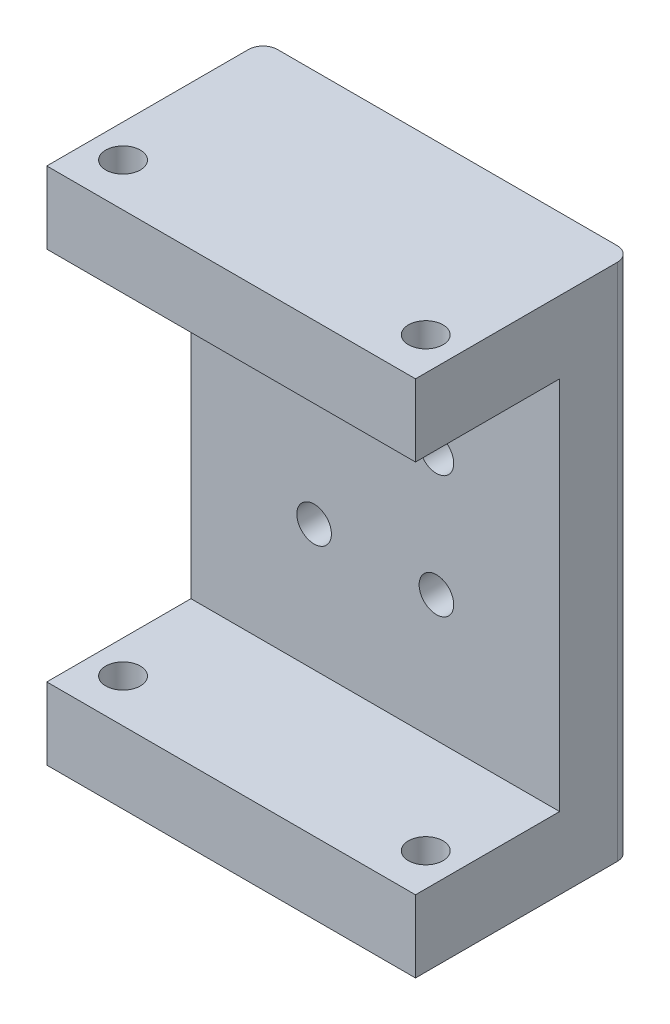
ISO-10303-21;
HEADER;
FILE_DESCRIPTION(('STEP AP214'),'2;1');
FILE_NAME('part.step','',(''),(''),'','','');
FILE_SCHEMA(('AUTOMOTIVE_DESIGN { 1 0 10303 214 1 1 1 1 }'));
ENDSEC;
DATA;
#1=APPLICATION_CONTEXT('core data for automotive mechanical design processes');
#2=APPLICATION_PROTOCOL_DEFINITION('international standard','automotive_design',2000,#1);
#3=PRODUCT_CONTEXT('',#1,'mechanical');
#4=PRODUCT('Part','Part','',(#3));
#5=PRODUCT_RELATED_PRODUCT_CATEGORY('part','',(#4));
#6=PRODUCT_DEFINITION_FORMATION('','',#4);
#7=PRODUCT_DEFINITION_CONTEXT('part definition',#1,'design');
#8=PRODUCT_DEFINITION('design','',#6,#7);
#9=PRODUCT_DEFINITION_SHAPE('','',#8);
#10=(LENGTH_UNIT() NAMED_UNIT(*) SI_UNIT(.MILLI.,.METRE.));
#11=(NAMED_UNIT(*) PLANE_ANGLE_UNIT() SI_UNIT($,.RADIAN.));
#12=(NAMED_UNIT(*) SI_UNIT($,.STERADIAN.) SOLID_ANGLE_UNIT());
#13=UNCERTAINTY_MEASURE_WITH_UNIT(LENGTH_MEASURE(1.E-05),#10,'distance_accuracy_value','');
#14=(GEOMETRIC_REPRESENTATION_CONTEXT(3) GLOBAL_UNCERTAINTY_ASSIGNED_CONTEXT((#13)) GLOBAL_UNIT_ASSIGNED_CONTEXT((#10,
#11,#12)) REPRESENTATION_CONTEXT('',''));
#15=CARTESIAN_POINT('',(0.,0.,0.));
#16=DIRECTION('',(0.,0.,1.));
#17=DIRECTION('',(1.,0.,0.));
#18=AXIS2_PLACEMENT_3D('',#15,#16,#17);
#19=CARTESIAN_POINT('',(-12.79,18.,15.));
#20=DIRECTION('',(0.,-1.,0.));
#21=DIRECTION('',(0.,0.,-1.));
#22=AXIS2_PLACEMENT_3D('',#19,#20,#21);
#23=PLANE('',#22);
#24=CARTESIAN_POINT('',(10.5,18.,12.));
#25=DIRECTION('',(0.,1.,0.));
#26=DIRECTION('',(0.,0.,1.));
#27=AXIS2_PLACEMENT_3D('',#24,#25,#26);
#28=CIRCLE('',#27,1.19999999999999);
#29=CARTESIAN_POINT('',(10.5,18.,13.2));
#30=VERTEX_POINT('',#29);
#31=EDGE_CURVE('E293',#30,#30,#28,.T.);
#32=ORIENTED_EDGE('',*,*,#31,.F.);
#33=EDGE_LOOP('',(#32));
#34=FACE_BOUND('',#33,.T.);
#35=DIRECTION('',(0.,0.,-1.));
#36=VECTOR('',#35,1.);
#37=CARTESIAN_POINT('',(12.79,18.,15.));
#38=LINE('',#37,#36);
#39=CARTESIAN_POINT('',(12.79,18.,15.));
#40=VERTEX_POINT('',#39);
#41=CARTESIAN_POINT('',(12.79,18.,1.));
#42=VERTEX_POINT('',#41);
#43=EDGE_CURVE('E186',#40,#42,#38,.T.);
#44=ORIENTED_EDGE('',*,*,#43,.T.);
#45=CARTESIAN_POINT('',(11.79,18.,1.));
#46=DIRECTION('',(0.,-1.,0.));
#47=DIRECTION('',(0.,0.,-1.));
#48=AXIS2_PLACEMENT_3D('',#45,#46,#47);
#49=CIRCLE('',#48,1.);
#50=CARTESIAN_POINT('',(11.79,18.,0.));
#51=VERTEX_POINT('',#50);
#52=EDGE_CURVE('E198',#42,#51,#49,.F.);
#53=ORIENTED_EDGE('',*,*,#52,.T.);
#54=DIRECTION('',(-1.,0.,0.));
#55=VECTOR('',#54,1.);
#56=CARTESIAN_POINT('',(-12.79,18.,0.));
#57=LINE('',#56,#55);
#58=CARTESIAN_POINT('',(-11.79,18.,0.));
#59=VERTEX_POINT('',#58);
#60=EDGE_CURVE('E160',#51,#59,#57,.T.);
#61=ORIENTED_EDGE('',*,*,#60,.T.);
#62=CARTESIAN_POINT('',(-11.79,18.,1.));
#63=DIRECTION('',(0.,-1.,0.));
#64=DIRECTION('',(0.,0.,-1.));
#65=AXIS2_PLACEMENT_3D('',#62,#63,#64);
#66=CIRCLE('',#65,1.);
#67=CARTESIAN_POINT('',(-12.79,18.,1.));
#68=VERTEX_POINT('',#67);
#69=EDGE_CURVE('E196',#59,#68,#66,.F.);
#70=ORIENTED_EDGE('',*,*,#69,.T.);
#71=DIRECTION('',(0.,0.,-1.));
#72=VECTOR('',#71,1.);
#73=CARTESIAN_POINT('',(-12.79,18.,15.));
#74=LINE('',#73,#72);
#75=CARTESIAN_POINT('',(-12.79,18.,15.));
#76=VERTEX_POINT('',#75);
#77=EDGE_CURVE('E183',#76,#68,#74,.T.);
#78=ORIENTED_EDGE('',*,*,#77,.F.);
#79=DIRECTION('',(-1.,0.,0.));
#80=VECTOR('',#79,1.);
#81=CARTESIAN_POINT('',(-12.79,18.,15.));
#82=LINE('',#81,#80);
#83=EDGE_CURVE('E166',#40,#76,#82,.T.);
#84=ORIENTED_EDGE('',*,*,#83,.F.);
#85=EDGE_LOOP('',(#44,#53,#61,#70,#78,#84));
#86=FACE_BOUND('',#85,.T.);
#87=CARTESIAN_POINT('',(-10.5,18.,12.));
#88=DIRECTION('',(0.,1.,0.));
#89=DIRECTION('',(0.,0.,1.));
#90=AXIS2_PLACEMENT_3D('',#87,#88,#89);
#91=CIRCLE('',#90,1.19999999999999);
#92=CARTESIAN_POINT('',(-10.5,18.,13.2));
#93=VERTEX_POINT('',#92);
#94=EDGE_CURVE('E296',#93,#93,#91,.T.);
#95=ORIENTED_EDGE('',*,*,#94,.F.);
#96=EDGE_LOOP('',(#95));
#97=FACE_BOUND('',#96,.T.);
#98=ADVANCED_FACE('F41',(#34,#86,#97),#23,.F.);
#99=CARTESIAN_POINT('',(0.,0.,15.));
#100=DIRECTION('',(0.,0.,1.));
#101=DIRECTION('',(1.,0.,0.));
#102=AXIS2_PLACEMENT_3D('',#99,#100,#101);
#103=PLANE('',#102);
#104=DIRECTION('',(-1.,0.,0.));
#105=VECTOR('',#104,1.);
#106=CARTESIAN_POINT('',(12.79,-13.,15.));
#107=LINE('',#106,#105);
#108=CARTESIAN_POINT('',(12.79,-13.,15.));
#109=VERTEX_POINT('',#108);
#110=CARTESIAN_POINT('',(-12.79,-13.,15.));
#111=VERTEX_POINT('',#110);
#112=EDGE_CURVE('E157',#109,#111,#107,.T.);
#113=ORIENTED_EDGE('',*,*,#112,.T.);
#114=DIRECTION('',(0.,-1.,0.));
#115=VECTOR('',#114,1.);
#116=CARTESIAN_POINT('',(-12.79,18.,15.));
#117=LINE('',#116,#115);
#118=CARTESIAN_POINT('',(-12.79,-18.,15.));
#119=VERTEX_POINT('',#118);
#120=EDGE_CURVE('E168',#111,#119,#117,.T.);
#121=ORIENTED_EDGE('',*,*,#120,.T.);
#122=DIRECTION('',(1.,0.,0.));
#123=VECTOR('',#122,1.);
#124=CARTESIAN_POINT('',(-12.79,-18.,15.));
#125=LINE('',#124,#123);
#126=CARTESIAN_POINT('',(12.79,-18.,15.));
#127=VERTEX_POINT('',#126);
#128=EDGE_CURVE('E172',#119,#127,#125,.T.);
#129=ORIENTED_EDGE('',*,*,#128,.T.);
#130=DIRECTION('',(0.,1.,0.));
#131=VECTOR('',#130,1.);
#132=CARTESIAN_POINT('',(12.79,18.,15.));
#133=LINE('',#132,#131);
#134=EDGE_CURVE('E163',#127,#109,#133,.T.);
#135=ORIENTED_EDGE('',*,*,#134,.T.);
#136=EDGE_LOOP('',(#113,#121,#129,#135));
#137=FACE_BOUND('',#136,.T.);
#138=ADVANCED_FACE('F226',(#137),#103,.T.);
#139=CARTESIAN_POINT('',(12.79,18.,15.));
#140=DIRECTION('',(-1.,0.,0.));
#141=DIRECTION('',(0.,-1.,0.));
#142=AXIS2_PLACEMENT_3D('',#139,#140,#141);
#143=PLANE('',#142);
#144=DIRECTION('',(0.,0.,-1.));
#145=VECTOR('',#144,1.);
#146=CARTESIAN_POINT('',(12.79,-18.,15.));
#147=LINE('',#146,#145);
#148=CARTESIAN_POINT('',(12.79,-18.,1.));
#149=VERTEX_POINT('',#148);
#150=EDGE_CURVE('E174',#127,#149,#147,.T.);
#151=ORIENTED_EDGE('',*,*,#150,.T.);
#152=DIRECTION('',(0.,1.,0.));
#153=VECTOR('',#152,1.);
#154=CARTESIAN_POINT('',(12.79,18.,1.));
#155=LINE('',#154,#153);
#156=EDGE_CURVE('E189',#149,#42,#155,.T.);
#157=ORIENTED_EDGE('',*,*,#156,.T.);
#158=ORIENTED_EDGE('',*,*,#43,.F.);
#159=CARTESIAN_POINT('',(12.79,13.,15.));
#160=VERTEX_POINT('',#159);
#161=EDGE_CURVE('E145',#160,#40,#133,.T.);
#162=ORIENTED_EDGE('',*,*,#161,.F.);
#163=DIRECTION('',(0.,0.,-1.));
#164=VECTOR('',#163,1.);
#165=CARTESIAN_POINT('',(12.79,13.,15.));
#166=LINE('',#165,#164);
#167=CARTESIAN_POINT('',(12.79,13.,5.));
#168=VERTEX_POINT('',#167);
#169=EDGE_CURVE('E123',#160,#168,#166,.T.);
#170=ORIENTED_EDGE('',*,*,#169,.T.);
#171=DIRECTION('',(0.,-1.,0.));
#172=VECTOR('',#171,1.);
#173=CARTESIAN_POINT('',(12.79,13.,5.));
#174=LINE('',#173,#172);
#175=CARTESIAN_POINT('',(12.79,-13.,5.));
#176=VERTEX_POINT('',#175);
#177=EDGE_CURVE('E134',#168,#176,#174,.T.);
#178=ORIENTED_EDGE('',*,*,#177,.T.);
#179=DIRECTION('',(0.,0.,1.));
#180=VECTOR('',#179,1.);
#181=CARTESIAN_POINT('',(12.79,-13.,15.));
#182=LINE('',#181,#180);
#183=EDGE_CURVE('E139',#176,#109,#182,.T.);
#184=ORIENTED_EDGE('',*,*,#183,.T.);
#185=ORIENTED_EDGE('',*,*,#134,.F.);
#186=EDGE_LOOP('',(#151,#157,#158,#162,#170,#178,#184,#185));
#187=FACE_BOUND('',#186,.T.);
#188=ADVANCED_FACE('F143',(#187),#143,.F.);
#189=CARTESIAN_POINT('',(-12.79,18.,15.));
#190=DIRECTION('',(1.,0.,0.));
#191=DIRECTION('',(0.,1.,0.));
#192=AXIS2_PLACEMENT_3D('',#189,#190,#191);
#193=PLANE('',#192);
#194=ORIENTED_EDGE('',*,*,#77,.T.);
#195=DIRECTION('',(0.,-1.,0.));
#196=VECTOR('',#195,1.);
#197=CARTESIAN_POINT('',(-12.79,18.,1.));
#198=LINE('',#197,#196);
#199=CARTESIAN_POINT('',(-12.79,-18.,1.));
#200=VERTEX_POINT('',#199);
#201=EDGE_CURVE('E11',#68,#200,#198,.T.);
#202=ORIENTED_EDGE('',*,*,#201,.T.);
#203=DIRECTION('',(0.,0.,-1.));
#204=VECTOR('',#203,1.);
#205=CARTESIAN_POINT('',(-12.79,-18.,15.));
#206=LINE('',#205,#204);
#207=EDGE_CURVE('E180',#119,#200,#206,.T.);
#208=ORIENTED_EDGE('',*,*,#207,.F.);
#209=ORIENTED_EDGE('',*,*,#120,.F.);
#210=DIRECTION('',(0.,0.,1.));
#211=VECTOR('',#210,1.);
#212=CARTESIAN_POINT('',(-12.79,-13.,15.));
#213=LINE('',#212,#211);
#214=CARTESIAN_POINT('',(-12.79,-13.,5.));
#215=VERTEX_POINT('',#214);
#216=EDGE_CURVE('E146',#215,#111,#213,.T.);
#217=ORIENTED_EDGE('',*,*,#216,.F.);
#218=DIRECTION('',(0.,-1.,0.));
#219=VECTOR('',#218,1.);
#220=CARTESIAN_POINT('',(-12.79,13.,5.));
#221=LINE('',#220,#219);
#222=CARTESIAN_POINT('',(-12.79,13.,5.));
#223=VERTEX_POINT('',#222);
#224=EDGE_CURVE('E148',#223,#215,#221,.T.);
#225=ORIENTED_EDGE('',*,*,#224,.F.);
#226=DIRECTION('',(0.,0.,-1.));
#227=VECTOR('',#226,1.);
#228=CARTESIAN_POINT('',(-12.79,13.,15.));
#229=LINE('',#228,#227);
#230=CARTESIAN_POINT('',(-12.79,13.,15.));
#231=VERTEX_POINT('',#230);
#232=EDGE_CURVE('E126',#231,#223,#229,.T.);
#233=ORIENTED_EDGE('',*,*,#232,.F.);
#234=EDGE_CURVE('E169',#76,#231,#117,.T.);
#235=ORIENTED_EDGE('',*,*,#234,.F.);
#236=EDGE_LOOP('',(#194,#202,#208,#209,#217,#225,#233,#235));
#237=FACE_BOUND('',#236,.T.);
#238=ADVANCED_FACE('F220',(#237),#193,.F.);
#239=CARTESIAN_POINT('',(-12.79,-18.,15.));
#240=DIRECTION('',(0.,1.,0.));
#241=DIRECTION('',(0.,0.,1.));
#242=AXIS2_PLACEMENT_3D('',#239,#240,#241);
#243=PLANE('',#242);
#244=CARTESIAN_POINT('',(-10.5,-18.,12.));
#245=DIRECTION('',(0.,1.,0.));
#246=DIRECTION('',(0.,0.,1.));
#247=AXIS2_PLACEMENT_3D('',#244,#245,#246);
#248=CIRCLE('',#247,1.19999999999998);
#249=CARTESIAN_POINT('',(-10.5,-18.,13.2));
#250=VERTEX_POINT('',#249);
#251=EDGE_CURVE('E290',#250,#250,#248,.T.);
#252=ORIENTED_EDGE('',*,*,#251,.T.);
#253=EDGE_LOOP('',(#252));
#254=FACE_BOUND('',#253,.T.);
#255=CARTESIAN_POINT('',(10.5,-18.,12.));
#256=DIRECTION('',(0.,1.,0.));
#257=DIRECTION('',(0.,0.,1.));
#258=AXIS2_PLACEMENT_3D('',#255,#256,#257);
#259=CIRCLE('',#258,1.19999999999998);
#260=CARTESIAN_POINT('',(10.5,-18.,13.2));
#261=VERTEX_POINT('',#260);
#262=EDGE_CURVE('E193',#261,#261,#259,.T.);
#263=ORIENTED_EDGE('',*,*,#262,.T.);
#264=EDGE_LOOP('',(#263));
#265=FACE_BOUND('',#264,.T.);
#266=DIRECTION('',(1.,0.,0.));
#267=VECTOR('',#266,1.);
#268=CARTESIAN_POINT('',(-12.79,-18.,0.));
#269=LINE('',#268,#267);
#270=CARTESIAN_POINT('',(-11.79,-18.,0.));
#271=VERTEX_POINT('',#270);
#272=CARTESIAN_POINT('',(11.79,-18.,0.));
#273=VERTEX_POINT('',#272);
#274=EDGE_CURVE('E177',#271,#273,#269,.T.);
#275=ORIENTED_EDGE('',*,*,#274,.T.);
#276=CARTESIAN_POINT('',(11.79,-18.,1.));
#277=DIRECTION('',(0.,1.,0.));
#278=DIRECTION('',(0.,0.,1.));
#279=AXIS2_PLACEMENT_3D('',#276,#277,#278);
#280=CIRCLE('',#279,1.);
#281=EDGE_CURVE('E49',#273,#149,#280,.F.);
#282=ORIENTED_EDGE('',*,*,#281,.T.);
#283=ORIENTED_EDGE('',*,*,#150,.F.);
#284=ORIENTED_EDGE('',*,*,#128,.F.);
#285=ORIENTED_EDGE('',*,*,#207,.T.);
#286=CARTESIAN_POINT('',(-11.79,-18.,1.));
#287=DIRECTION('',(0.,1.,0.));
#288=DIRECTION('',(0.,0.,1.));
#289=AXIS2_PLACEMENT_3D('',#286,#287,#288);
#290=CIRCLE('',#289,1.);
#291=EDGE_CURVE('E56',#200,#271,#290,.F.);
#292=ORIENTED_EDGE('',*,*,#291,.T.);
#293=EDGE_LOOP('',(#275,#282,#283,#284,#285,#292));
#294=FACE_BOUND('',#293,.T.);
#295=ADVANCED_FACE('F206',(#254,#265,#294),#243,.F.);
#296=DIRECTION('',(-1.,0.,0.));
#297=VECTOR('',#296,1.);
#298=CARTESIAN_POINT('',(12.79,13.,15.));
#299=LINE('',#298,#297);
#300=EDGE_CURVE('E131',#160,#231,#299,.T.);
#301=ORIENTED_EDGE('',*,*,#300,.F.);
#302=ORIENTED_EDGE('',*,*,#161,.T.);
#303=ORIENTED_EDGE('',*,*,#83,.T.);
#304=ORIENTED_EDGE('',*,*,#234,.T.);
#305=EDGE_LOOP('',(#301,#302,#303,#304));
#306=FACE_BOUND('',#305,.T.);
#307=ADVANCED_FACE('F223',(#306),#103,.T.);
#308=CARTESIAN_POINT('',(0.,0.,0.));
#309=DIRECTION('',(0.,0.,1.));
#310=DIRECTION('',(1.,0.,0.));
#311=AXIS2_PLACEMENT_3D('',#308,#309,#310);
#312=PLANE('',#311);
#313=CARTESIAN_POINT('',(4.24264068711928,4.24264068711928,0.));
#314=DIRECTION('',(0.,0.,1.));
#315=DIRECTION('',(1.,0.,0.));
#316=AXIS2_PLACEMENT_3D('',#313,#314,#315);
#317=CIRCLE('',#316,1.19999999999999);
#318=CARTESIAN_POINT('',(5.44264068711927,4.24264068711928,0.));
#319=VERTEX_POINT('',#318);
#320=EDGE_CURVE('E336',#319,#319,#317,.T.);
#321=ORIENTED_EDGE('',*,*,#320,.T.);
#322=EDGE_LOOP('',(#321));
#323=FACE_BOUND('',#322,.T.);
#324=CARTESIAN_POINT('',(-4.24264068711928,-4.24264068711928,0.));
#325=DIRECTION('',(0.,0.,1.));
#326=DIRECTION('',(1.,0.,0.));
#327=AXIS2_PLACEMENT_3D('',#324,#325,#326);
#328=CIRCLE('',#327,1.19999999999999);
#329=CARTESIAN_POINT('',(-3.0426406871193,-4.24264068711928,0.));
#330=VERTEX_POINT('',#329);
#331=EDGE_CURVE('E330',#330,#330,#328,.T.);
#332=ORIENTED_EDGE('',*,*,#331,.T.);
#333=EDGE_LOOP('',(#332));
#334=FACE_BOUND('',#333,.T.);
#335=CARTESIAN_POINT('',(4.24264068711928,-4.24264068711928,0.));
#336=DIRECTION('',(0.,0.,1.));
#337=DIRECTION('',(1.,0.,0.));
#338=AXIS2_PLACEMENT_3D('',#335,#336,#337);
#339=CIRCLE('',#338,1.19999999999999);
#340=CARTESIAN_POINT('',(5.44264068711927,-4.24264068711928,0.));
#341=VERTEX_POINT('',#340);
#342=EDGE_CURVE('E324',#341,#341,#339,.T.);
#343=ORIENTED_EDGE('',*,*,#342,.T.);
#344=EDGE_LOOP('',(#343));
#345=FACE_BOUND('',#344,.T.);
#346=CARTESIAN_POINT('',(-4.24264068711928,4.24264068711928,0.));
#347=DIRECTION('',(0.,0.,1.));
#348=DIRECTION('',(1.,0.,0.));
#349=AXIS2_PLACEMENT_3D('',#346,#347,#348);
#350=CIRCLE('',#349,1.19999999999999);
#351=CARTESIAN_POINT('',(-3.0426406871193,4.24264068711928,0.));
#352=VERTEX_POINT('',#351);
#353=EDGE_CURVE('E316',#352,#352,#350,.T.);
#354=ORIENTED_EDGE('',*,*,#353,.T.);
#355=EDGE_LOOP('',(#354));
#356=FACE_BOUND('',#355,.T.);
#357=CARTESIAN_POINT('',(0.,0.,0.));
#358=DIRECTION('',(0.,0.,-1.));
#359=DIRECTION('',(-1.,0.,0.));
#360=AXIS2_PLACEMENT_3D('',#357,#358,#359);
#361=CIRCLE('',#360,4.25);
#362=CARTESIAN_POINT('',(-4.25,0.,0.));
#363=VERTEX_POINT('',#362);
#364=EDGE_CURVE('E313',#363,#363,#361,.T.);
#365=ORIENTED_EDGE('',*,*,#364,.F.);
#366=EDGE_LOOP('',(#365));
#367=FACE_BOUND('',#366,.T.);
#368=ORIENTED_EDGE('',*,*,#60,.F.);
#369=DIRECTION('',(0.,1.,0.));
#370=VECTOR('',#369,1.);
#371=CARTESIAN_POINT('',(11.79,0.,0.));
#372=LINE('',#371,#370);
#373=EDGE_CURVE('E63',#51,#273,#372,.F.);
#374=ORIENTED_EDGE('',*,*,#373,.T.);
#375=ORIENTED_EDGE('',*,*,#274,.F.);
#376=DIRECTION('',(0.,-1.,0.));
#377=VECTOR('',#376,1.);
#378=CARTESIAN_POINT('',(-11.79,0.,0.));
#379=LINE('',#378,#377);
#380=EDGE_CURVE('E200',#271,#59,#379,.F.);
#381=ORIENTED_EDGE('',*,*,#380,.T.);
#382=EDGE_LOOP('',(#368,#374,#375,#381));
#383=FACE_BOUND('',#382,.T.);
#384=ADVANCED_FACE('F216',(#323,#334,#345,#356,#367,#383),#312,.F.);
#385=CARTESIAN_POINT('',(12.79,-13.,15.));
#386=DIRECTION('',(0.,-1.,0.));
#387=DIRECTION('',(0.,0.,-1.));
#388=AXIS2_PLACEMENT_3D('',#385,#386,#387);
#389=PLANE('',#388);
#390=CARTESIAN_POINT('',(-10.5,-13.,12.));
#391=DIRECTION('',(0.,-1.,0.));
#392=DIRECTION('',(0.,0.,-1.));
#393=AXIS2_PLACEMENT_3D('',#390,#391,#392);
#394=CIRCLE('',#393,1.19999999999999);
#395=CARTESIAN_POINT('',(-10.5,-13.,10.8));
#396=VERTEX_POINT('',#395);
#397=EDGE_CURVE('E289',#396,#396,#394,.T.);
#398=ORIENTED_EDGE('',*,*,#397,.T.);
#399=EDGE_LOOP('',(#398));
#400=FACE_BOUND('',#399,.T.);
#401=CARTESIAN_POINT('',(10.5,-13.,12.));
#402=DIRECTION('',(0.,-1.,0.));
#403=DIRECTION('',(0.,0.,-1.));
#404=AXIS2_PLACEMENT_3D('',#401,#402,#403);
#405=CIRCLE('',#404,1.19999999999999);
#406=CARTESIAN_POINT('',(10.5,-13.,10.8));
#407=VERTEX_POINT('',#406);
#408=EDGE_CURVE('E151',#407,#407,#405,.T.);
#409=ORIENTED_EDGE('',*,*,#408,.T.);
#410=EDGE_LOOP('',(#409));
#411=FACE_BOUND('',#410,.T.);
#412=ORIENTED_EDGE('',*,*,#216,.T.);
#413=ORIENTED_EDGE('',*,*,#112,.F.);
#414=ORIENTED_EDGE('',*,*,#183,.F.);
#415=DIRECTION('',(-1.,0.,0.));
#416=VECTOR('',#415,1.);
#417=CARTESIAN_POINT('',(12.79,-13.,5.));
#418=LINE('',#417,#416);
#419=EDGE_CURVE('E130',#176,#215,#418,.T.);
#420=ORIENTED_EDGE('',*,*,#419,.T.);
#421=EDGE_LOOP('',(#412,#413,#414,#420));
#422=FACE_BOUND('',#421,.T.);
#423=ADVANCED_FACE('F232',(#400,#411,#422),#389,.F.);
#424=CARTESIAN_POINT('',(12.79,13.,5.));
#425=DIRECTION('',(0.,0.,-1.));
#426=DIRECTION('',(-1.,0.,0.));
#427=AXIS2_PLACEMENT_3D('',#424,#425,#426);
#428=PLANE('',#427);
#429=CARTESIAN_POINT('',(4.24264068711928,4.24264068711928,5.));
#430=DIRECTION('',(0.,0.,1.));
#431=DIRECTION('',(1.,0.,0.));
#432=AXIS2_PLACEMENT_3D('',#429,#430,#431);
#433=CIRCLE('',#432,1.19999999999999);
#434=CARTESIAN_POINT('',(5.44264068711927,4.24264068711928,5.));
#435=VERTEX_POINT('',#434);
#436=EDGE_CURVE('E339',#435,#435,#433,.T.);
#437=ORIENTED_EDGE('',*,*,#436,.F.);
#438=EDGE_LOOP('',(#437));
#439=FACE_BOUND('',#438,.T.);
#440=CARTESIAN_POINT('',(-4.24264068711928,-4.24264068711928,5.));
#441=DIRECTION('',(0.,0.,1.));
#442=DIRECTION('',(1.,0.,0.));
#443=AXIS2_PLACEMENT_3D('',#440,#441,#442);
#444=CIRCLE('',#443,1.19999999999999);
#445=CARTESIAN_POINT('',(-3.0426406871193,-4.24264068711928,5.));
#446=VERTEX_POINT('',#445);
#447=EDGE_CURVE('E333',#446,#446,#444,.T.);
#448=ORIENTED_EDGE('',*,*,#447,.F.);
#449=EDGE_LOOP('',(#448));
#450=FACE_BOUND('',#449,.T.);
#451=CARTESIAN_POINT('',(4.24264068711928,-4.24264068711928,5.));
#452=DIRECTION('',(0.,0.,1.));
#453=DIRECTION('',(1.,0.,0.));
#454=AXIS2_PLACEMENT_3D('',#451,#452,#453);
#455=CIRCLE('',#454,1.19999999999999);
#456=CARTESIAN_POINT('',(5.44264068711927,-4.24264068711928,5.));
#457=VERTEX_POINT('',#456);
#458=EDGE_CURVE('E327',#457,#457,#455,.T.);
#459=ORIENTED_EDGE('',*,*,#458,.F.);
#460=EDGE_LOOP('',(#459));
#461=FACE_BOUND('',#460,.T.);
#462=CARTESIAN_POINT('',(-4.24264068711928,4.24264068711928,5.));
#463=DIRECTION('',(0.,0.,1.));
#464=DIRECTION('',(1.,0.,0.));
#465=AXIS2_PLACEMENT_3D('',#462,#463,#464);
#466=CIRCLE('',#465,1.19999999999999);
#467=CARTESIAN_POINT('',(-3.0426406871193,4.24264068711928,5.));
#468=VERTEX_POINT('',#467);
#469=EDGE_CURVE('E321',#468,#468,#466,.T.);
#470=ORIENTED_EDGE('',*,*,#469,.F.);
#471=EDGE_LOOP('',(#470));
#472=FACE_BOUND('',#471,.T.);
#473=ORIENTED_EDGE('',*,*,#224,.T.);
#474=ORIENTED_EDGE('',*,*,#419,.F.);
#475=ORIENTED_EDGE('',*,*,#177,.F.);
#476=DIRECTION('',(-1.,0.,0.));
#477=VECTOR('',#476,1.);
#478=CARTESIAN_POINT('',(12.79,13.,5.));
#479=LINE('',#478,#477);
#480=EDGE_CURVE('E119',#168,#223,#479,.T.);
#481=ORIENTED_EDGE('',*,*,#480,.T.);
#482=EDGE_LOOP('',(#473,#474,#475,#481));
#483=FACE_BOUND('',#482,.T.);
#484=ADVANCED_FACE('F135',(#439,#450,#461,#472,#483),#428,.F.);
#485=CARTESIAN_POINT('',(12.79,13.,15.));
#486=DIRECTION('',(0.,1.,0.));
#487=DIRECTION('',(0.,0.,1.));
#488=AXIS2_PLACEMENT_3D('',#485,#486,#487);
#489=PLANE('',#488);
#490=CARTESIAN_POINT('',(-10.5,13.,12.));
#491=DIRECTION('',(0.,1.,0.));
#492=DIRECTION('',(0.,0.,1.));
#493=AXIS2_PLACEMENT_3D('',#490,#491,#492);
#494=CIRCLE('',#493,1.19999999999999);
#495=CARTESIAN_POINT('',(-10.5,13.,13.2));
#496=VERTEX_POINT('',#495);
#497=EDGE_CURVE('E286',#496,#496,#494,.T.);
#498=ORIENTED_EDGE('',*,*,#497,.T.);
#499=EDGE_LOOP('',(#498));
#500=FACE_BOUND('',#499,.T.);
#501=CARTESIAN_POINT('',(10.5,13.,12.));
#502=DIRECTION('',(0.,1.,0.));
#503=DIRECTION('',(0.,0.,1.));
#504=AXIS2_PLACEMENT_3D('',#501,#502,#503);
#505=CIRCLE('',#504,1.19999999999999);
#506=CARTESIAN_POINT('',(10.5,13.,13.2));
#507=VERTEX_POINT('',#506);
#508=EDGE_CURVE('E190',#507,#507,#505,.T.);
#509=ORIENTED_EDGE('',*,*,#508,.T.);
#510=EDGE_LOOP('',(#509));
#511=FACE_BOUND('',#510,.T.);
#512=ORIENTED_EDGE('',*,*,#232,.T.);
#513=ORIENTED_EDGE('',*,*,#480,.F.);
#514=ORIENTED_EDGE('',*,*,#169,.F.);
#515=ORIENTED_EDGE('',*,*,#300,.T.);
#516=EDGE_LOOP('',(#512,#513,#514,#515));
#517=FACE_BOUND('',#516,.T.);
#518=ADVANCED_FACE('F121',(#500,#511,#517),#489,.F.);
#519=CARTESIAN_POINT('',(10.5,18.,12.));
#520=DIRECTION('',(0.,1.,0.));
#521=DIRECTION('',(0.,0.,1.));
#522=AXIS2_PLACEMENT_3D('',#519,#520,#521);
#523=CYLINDRICAL_SURFACE('',#522,1.19999999999999);
#524=ORIENTED_EDGE('',*,*,#31,.T.);
#525=EDGE_LOOP('',(#524));
#526=FACE_BOUND('',#525,.T.);
#527=ORIENTED_EDGE('',*,*,#508,.F.);
#528=EDGE_LOOP('',(#527));
#529=FACE_BOUND('',#528,.T.);
#530=ADVANCED_FACE('F271',(#526,#529),#523,.F.);
#531=ORIENTED_EDGE('',*,*,#262,.F.);
#532=EDGE_LOOP('',(#531));
#533=FACE_BOUND('',#532,.T.);
#534=ORIENTED_EDGE('',*,*,#408,.F.);
#535=EDGE_LOOP('',(#534));
#536=FACE_BOUND('',#535,.T.);
#537=ADVANCED_FACE('F262',(#533,#536),#523,.F.);
#538=CARTESIAN_POINT('',(-10.5,18.,12.));
#539=DIRECTION('',(0.,1.,0.));
#540=DIRECTION('',(0.,0.,1.));
#541=AXIS2_PLACEMENT_3D('',#538,#539,#540);
#542=CYLINDRICAL_SURFACE('',#541,1.19999999999999);
#543=ORIENTED_EDGE('',*,*,#251,.F.);
#544=EDGE_LOOP('',(#543));
#545=FACE_BOUND('',#544,.T.);
#546=ORIENTED_EDGE('',*,*,#397,.F.);
#547=EDGE_LOOP('',(#546));
#548=FACE_BOUND('',#547,.T.);
#549=ADVANCED_FACE('F256',(#545,#548),#542,.F.);
#550=ORIENTED_EDGE('',*,*,#94,.T.);
#551=EDGE_LOOP('',(#550));
#552=FACE_BOUND('',#551,.T.);
#553=ORIENTED_EDGE('',*,*,#497,.F.);
#554=EDGE_LOOP('',(#553));
#555=FACE_BOUND('',#554,.T.);
#556=ADVANCED_FACE('F251',(#552,#555),#542,.F.);
#557=CARTESIAN_POINT('',(11.79,18.,1.));
#558=DIRECTION('',(0.,1.,0.));
#559=DIRECTION('',(-1.,0.,0.));
#560=AXIS2_PLACEMENT_3D('',#557,#558,#559);
#561=CYLINDRICAL_SURFACE('',#560,1.);
#562=ORIENTED_EDGE('',*,*,#281,.F.);
#563=ORIENTED_EDGE('',*,*,#373,.F.);
#564=ORIENTED_EDGE('',*,*,#52,.F.);
#565=ORIENTED_EDGE('',*,*,#156,.F.);
#566=EDGE_LOOP('',(#562,#563,#564,#565));
#567=FACE_BOUND('',#566,.T.);
#568=ADVANCED_FACE('F211',(#567),#561,.T.);
#569=CARTESIAN_POINT('',(-11.79,18.,1.));
#570=DIRECTION('',(0.,-1.,0.));
#571=DIRECTION('',(1.,0.,0.));
#572=AXIS2_PLACEMENT_3D('',#569,#570,#571);
#573=CYLINDRICAL_SURFACE('',#572,1.);
#574=ORIENTED_EDGE('',*,*,#69,.F.);
#575=ORIENTED_EDGE('',*,*,#380,.F.);
#576=ORIENTED_EDGE('',*,*,#291,.F.);
#577=ORIENTED_EDGE('',*,*,#201,.F.);
#578=EDGE_LOOP('',(#574,#575,#576,#577));
#579=FACE_BOUND('',#578,.T.);
#580=ADVANCED_FACE('F43',(#579),#573,.T.);
#581=CARTESIAN_POINT('',(0.,0.,1.5));
#582=DIRECTION('',(0.,0.,-1.));
#583=DIRECTION('',(-1.,0.,0.));
#584=AXIS2_PLACEMENT_3D('',#581,#582,#583);
#585=CYLINDRICAL_SURFACE('',#584,4.25);
#586=CARTESIAN_POINT('',(0.,0.,1.5));
#587=DIRECTION('',(0.,0.,-1.));
#588=DIRECTION('',(-1.,0.,0.));
#589=AXIS2_PLACEMENT_3D('',#586,#587,#588);
#590=CIRCLE('',#589,4.25);
#591=CARTESIAN_POINT('',(-4.25,0.,1.5));
#592=VERTEX_POINT('',#591);
#593=EDGE_CURVE('E312',#592,#592,#590,.T.);
#594=ORIENTED_EDGE('',*,*,#593,.F.);
#595=EDGE_LOOP('',(#594));
#596=FACE_BOUND('',#595,.T.);
#597=ORIENTED_EDGE('',*,*,#364,.T.);
#598=EDGE_LOOP('',(#597));
#599=FACE_BOUND('',#598,.T.);
#600=ADVANCED_FACE('F255',(#596,#599),#585,.F.);
#601=CARTESIAN_POINT('',(0.,0.,1.5));
#602=DIRECTION('',(0.,0.,-1.));
#603=DIRECTION('',(-1.,0.,0.));
#604=AXIS2_PLACEMENT_3D('',#601,#602,#603);
#605=PLANE('',#604);
#606=ORIENTED_EDGE('',*,*,#593,.T.);
#607=EDGE_LOOP('',(#606));
#608=FACE_BOUND('',#607,.T.);
#609=ADVANCED_FACE('F354',(#608),#605,.T.);
#610=CARTESIAN_POINT('',(-4.24264068711928,4.24264068711928,5.));
#611=DIRECTION('',(0.,0.,1.));
#612=DIRECTION('',(1.,0.,0.));
#613=AXIS2_PLACEMENT_3D('',#610,#611,#612);
#614=CYLINDRICAL_SURFACE('',#613,1.19999999999999);
#615=ORIENTED_EDGE('',*,*,#353,.F.);
#616=EDGE_LOOP('',(#615));
#617=FACE_BOUND('',#616,.T.);
#618=ORIENTED_EDGE('',*,*,#469,.T.);
#619=EDGE_LOOP('',(#618));
#620=FACE_BOUND('',#619,.T.);
#621=ADVANCED_FACE('F351',(#617,#620),#614,.F.);
#622=CARTESIAN_POINT('',(4.24264068711928,-4.24264068711928,5.));
#623=DIRECTION('',(0.,0.,1.));
#624=DIRECTION('',(1.,0.,0.));
#625=AXIS2_PLACEMENT_3D('',#622,#623,#624);
#626=CYLINDRICAL_SURFACE('',#625,1.19999999999999);
#627=ORIENTED_EDGE('',*,*,#342,.F.);
#628=EDGE_LOOP('',(#627));
#629=FACE_BOUND('',#628,.T.);
#630=ORIENTED_EDGE('',*,*,#458,.T.);
#631=EDGE_LOOP('',(#630));
#632=FACE_BOUND('',#631,.T.);
#633=ADVANCED_FACE('F353',(#629,#632),#626,.F.);
#634=CARTESIAN_POINT('',(-4.24264068711928,-4.24264068711928,5.));
#635=DIRECTION('',(0.,0.,1.));
#636=DIRECTION('',(1.,0.,0.));
#637=AXIS2_PLACEMENT_3D('',#634,#635,#636);
#638=CYLINDRICAL_SURFACE('',#637,1.19999999999999);
#639=ORIENTED_EDGE('',*,*,#331,.F.);
#640=EDGE_LOOP('',(#639));
#641=FACE_BOUND('',#640,.T.);
#642=ORIENTED_EDGE('',*,*,#447,.T.);
#643=EDGE_LOOP('',(#642));
#644=FACE_BOUND('',#643,.T.);
#645=ADVANCED_FACE('F360',(#641,#644),#638,.F.);
#646=CARTESIAN_POINT('',(4.24264068711928,4.24264068711928,5.));
#647=DIRECTION('',(0.,0.,1.));
#648=DIRECTION('',(1.,0.,0.));
#649=AXIS2_PLACEMENT_3D('',#646,#647,#648);
#650=CYLINDRICAL_SURFACE('',#649,1.19999999999999);
#651=ORIENTED_EDGE('',*,*,#320,.F.);
#652=EDGE_LOOP('',(#651));
#653=FACE_BOUND('',#652,.T.);
#654=ORIENTED_EDGE('',*,*,#436,.T.);
#655=EDGE_LOOP('',(#654));
#656=FACE_BOUND('',#655,.T.);
#657=ADVANCED_FACE('F343',(#653,#656),#650,.F.);
#658=CLOSED_SHELL('',(#98,#138,#188,#238,#295,#307,#384,#423,#484,#518,#530,#537,#549,#556,#568,
#580,#600,#609,#621,#633,#645,#657));
#659=MANIFOLD_SOLID_BREP('B2',#658);
#660=ADVANCED_BREP_SHAPE_REPRESENTATION('',(#18,#659),#14);
#661=SHAPE_DEFINITION_REPRESENTATION(#9,#660);
ENDSEC;
END-ISO-10303-21;
